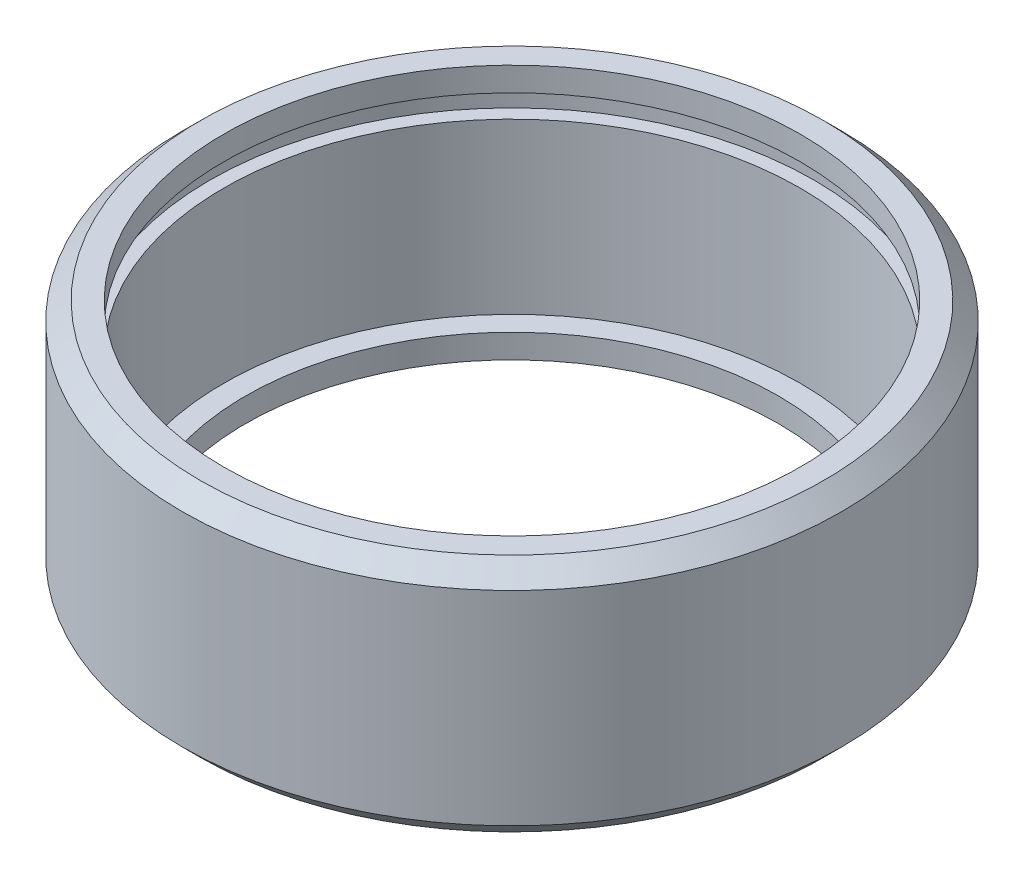
ISO-10303-21;
HEADER;
FILE_DESCRIPTION(('STEP AP214'),'2;1');
FILE_NAME('part.step','',(''),(''),'','','');
FILE_SCHEMA(('AUTOMOTIVE_DESIGN { 1 0 10303 214 1 1 1 1 }'));
ENDSEC;
DATA;
#1=APPLICATION_CONTEXT('core data for automotive mechanical design processes');
#2=APPLICATION_PROTOCOL_DEFINITION('international standard','automotive_design',2000,#1);
#3=PRODUCT_CONTEXT('',#1,'mechanical');
#4=PRODUCT('Part','Part','',(#3));
#5=PRODUCT_RELATED_PRODUCT_CATEGORY('part','',(#4));
#6=PRODUCT_DEFINITION_FORMATION('','',#4);
#7=PRODUCT_DEFINITION_CONTEXT('part definition',#1,'design');
#8=PRODUCT_DEFINITION('design','',#6,#7);
#9=PRODUCT_DEFINITION_SHAPE('','',#8);
#10=(LENGTH_UNIT() NAMED_UNIT(*) SI_UNIT(.MILLI.,.METRE.));
#11=(NAMED_UNIT(*) PLANE_ANGLE_UNIT() SI_UNIT($,.RADIAN.));
#12=(NAMED_UNIT(*) SI_UNIT($,.STERADIAN.) SOLID_ANGLE_UNIT());
#13=UNCERTAINTY_MEASURE_WITH_UNIT(LENGTH_MEASURE(1.E-05),#10,'distance_accuracy_value','');
#14=(GEOMETRIC_REPRESENTATION_CONTEXT(3) GLOBAL_UNCERTAINTY_ASSIGNED_CONTEXT((#13)) GLOBAL_UNIT_ASSIGNED_CONTEXT((#10,
#11,#12)) REPRESENTATION_CONTEXT('',''));
#15=CARTESIAN_POINT('',(0.,0.,0.));
#16=DIRECTION('',(0.,0.,1.));
#17=DIRECTION('',(1.,0.,0.));
#18=AXIS2_PLACEMENT_3D('',#15,#16,#17);
#19=CARTESIAN_POINT('',(13.,0.,0.));
#20=DIRECTION('',(0.,-1.,0.));
#21=DIRECTION('',(0.,0.,-1.));
#22=AXIS2_PLACEMENT_3D('',#19,#20,#21);
#23=PLANE('',#22);
#24=CARTESIAN_POINT('',(0.,0.,0.));
#25=DIRECTION('',(0.,-1.,0.));
#26=DIRECTION('',(0.,0.,-1.));
#27=AXIS2_PLACEMENT_3D('',#24,#25,#26);
#28=CIRCLE('',#27,13.);
#29=CARTESIAN_POINT('',(0.,0.,-13.));
#30=VERTEX_POINT('',#29);
#31=EDGE_CURVE('E94',#30,#30,#28,.T.);
#32=ORIENTED_EDGE('',*,*,#31,.T.);
#33=EDGE_LOOP('',(#32));
#34=FACE_BOUND('',#33,.T.);
#35=CARTESIAN_POINT('',(0.,0.,0.));
#36=DIRECTION('',(0.,-1.,0.));
#37=DIRECTION('',(0.,0.,-1.));
#38=AXIS2_PLACEMENT_3D('',#35,#36,#37);
#39=CIRCLE('',#38,11.1125);
#40=CARTESIAN_POINT('',(0.,0.,-11.1125));
#41=VERTEX_POINT('',#40);
#42=EDGE_CURVE('E10',#41,#41,#39,.T.);
#43=ORIENTED_EDGE('',*,*,#42,.F.);
#44=EDGE_LOOP('',(#43));
#45=FACE_BOUND('',#44,.T.);
#46=ADVANCED_FACE('F43',(#34,#45),#23,.T.);
#47=CARTESIAN_POINT('',(0.,0.,0.));
#48=DIRECTION('',(0.,-1.,0.));
#49=DIRECTION('',(0.,0.,-1.));
#50=AXIS2_PLACEMENT_3D('',#47,#48,#49);
#51=CYLINDRICAL_SURFACE('',#50,11.1125);
#52=ORIENTED_EDGE('',*,*,#42,.T.);
#53=EDGE_LOOP('',(#52));
#54=FACE_BOUND('',#53,.T.);
#55=CARTESIAN_POINT('',(0.,1.,0.));
#56=DIRECTION('',(0.,-1.,0.));
#57=DIRECTION('',(0.,0.,-1.));
#58=AXIS2_PLACEMENT_3D('',#55,#56,#57);
#59=CIRCLE('',#58,11.1125);
#60=CARTESIAN_POINT('',(0.,1.,-11.1125));
#61=VERTEX_POINT('',#60);
#62=EDGE_CURVE('E50',#61,#61,#59,.T.);
#63=ORIENTED_EDGE('',*,*,#62,.F.);
#64=EDGE_LOOP('',(#63));
#65=FACE_BOUND('',#64,.T.);
#66=ADVANCED_FACE('F113',(#54,#65),#51,.F.);
#67=CARTESIAN_POINT('',(11.1125,1.,0.));
#68=DIRECTION('',(0.,1.,0.));
#69=DIRECTION('',(0.,0.,1.));
#70=AXIS2_PLACEMENT_3D('',#67,#68,#69);
#71=PLANE('',#70);
#72=ORIENTED_EDGE('',*,*,#62,.T.);
#73=EDGE_LOOP('',(#72));
#74=FACE_BOUND('',#73,.T.);
#75=CARTESIAN_POINT('',(0.,1.,0.));
#76=DIRECTION('',(0.,-1.,0.));
#77=DIRECTION('',(0.,0.,-1.));
#78=AXIS2_PLACEMENT_3D('',#75,#76,#77);
#79=CIRCLE('',#78,12.025);
#80=CARTESIAN_POINT('',(0.,1.,-12.025));
#81=VERTEX_POINT('',#80);
#82=EDGE_CURVE('E55',#81,#81,#79,.T.);
#83=ORIENTED_EDGE('',*,*,#82,.F.);
#84=EDGE_LOOP('',(#83));
#85=FACE_BOUND('',#84,.T.);
#86=ADVANCED_FACE('F117',(#74,#85),#71,.T.);
#87=CARTESIAN_POINT('',(0.,0.,0.));
#88=DIRECTION('',(0.,-1.,0.));
#89=DIRECTION('',(0.,0.,-1.));
#90=AXIS2_PLACEMENT_3D('',#87,#88,#89);
#91=CYLINDRICAL_SURFACE('',#90,12.025);
#92=ORIENTED_EDGE('',*,*,#82,.T.);
#93=EDGE_LOOP('',(#92));
#94=FACE_BOUND('',#93,.T.);
#95=CARTESIAN_POINT('',(0.,8.05,0.));
#96=DIRECTION('',(0.,-1.,0.));
#97=DIRECTION('',(0.,0.,-1.));
#98=AXIS2_PLACEMENT_3D('',#95,#96,#97);
#99=CIRCLE('',#98,12.025);
#100=CARTESIAN_POINT('',(0.,8.05,-12.025));
#101=VERTEX_POINT('',#100);
#102=EDGE_CURVE('E60',#101,#101,#99,.T.);
#103=ORIENTED_EDGE('',*,*,#102,.F.);
#104=EDGE_LOOP('',(#103));
#105=FACE_BOUND('',#104,.T.);
#106=ADVANCED_FACE('F121',(#94,#105),#91,.F.);
#107=CARTESIAN_POINT('',(12.025,8.05,0.));
#108=DIRECTION('',(0.,1.,0.));
#109=DIRECTION('',(0.,0.,1.));
#110=AXIS2_PLACEMENT_3D('',#107,#108,#109);
#111=PLANE('',#110);
#112=ORIENTED_EDGE('',*,*,#102,.T.);
#113=EDGE_LOOP('',(#112));
#114=FACE_BOUND('',#113,.T.);
#115=CARTESIAN_POINT('',(0.,8.05,0.));
#116=DIRECTION('',(0.,-1.,0.));
#117=DIRECTION('',(0.,0.,-1.));
#118=AXIS2_PLACEMENT_3D('',#115,#116,#117);
#119=CIRCLE('',#118,12.6);
#120=CARTESIAN_POINT('',(0.,8.05,-12.6));
#121=VERTEX_POINT('',#120);
#122=EDGE_CURVE('E66',#121,#121,#119,.T.);
#123=ORIENTED_EDGE('',*,*,#122,.F.);
#124=EDGE_LOOP('',(#123));
#125=FACE_BOUND('',#124,.T.);
#126=ADVANCED_FACE('F127',(#114,#125),#111,.T.);
#127=CARTESIAN_POINT('',(0.,0.,0.));
#128=DIRECTION('',(0.,-1.,0.));
#129=DIRECTION('',(0.,0.,-1.));
#130=AXIS2_PLACEMENT_3D('',#127,#128,#129);
#131=CYLINDRICAL_SURFACE('',#130,12.6);
#132=ORIENTED_EDGE('',*,*,#122,.T.);
#133=EDGE_LOOP('',(#132));
#134=FACE_BOUND('',#133,.T.);
#135=CARTESIAN_POINT('',(0.,9.,0.));
#136=DIRECTION('',(0.,-1.,0.));
#137=DIRECTION('',(0.,0.,-1.));
#138=AXIS2_PLACEMENT_3D('',#135,#136,#137);
#139=CIRCLE('',#138,12.6);
#140=CARTESIAN_POINT('',(0.,9.,-12.6));
#141=VERTEX_POINT('',#140);
#142=EDGE_CURVE('E70',#141,#141,#139,.T.);
#143=ORIENTED_EDGE('',*,*,#142,.F.);
#144=EDGE_LOOP('',(#143));
#145=FACE_BOUND('',#144,.T.);
#146=ADVANCED_FACE('F131',(#134,#145),#131,.F.);
#147=CARTESIAN_POINT('',(12.025,9.,0.));
#148=DIRECTION('',(0.,-1.,0.));
#149=DIRECTION('',(0.,0.,-1.));
#150=AXIS2_PLACEMENT_3D('',#147,#148,#149);
#151=PLANE('',#150);
#152=ORIENTED_EDGE('',*,*,#142,.T.);
#153=EDGE_LOOP('',(#152));
#154=FACE_BOUND('',#153,.T.);
#155=CARTESIAN_POINT('',(0.,9.,0.));
#156=DIRECTION('',(0.,-1.,0.));
#157=DIRECTION('',(0.,0.,-1.));
#158=AXIS2_PLACEMENT_3D('',#155,#156,#157);
#159=CIRCLE('',#158,12.025);
#160=CARTESIAN_POINT('',(0.,9.,-12.025));
#161=VERTEX_POINT('',#160);
#162=EDGE_CURVE('E74',#161,#161,#159,.T.);
#163=ORIENTED_EDGE('',*,*,#162,.F.);
#164=EDGE_LOOP('',(#163));
#165=FACE_BOUND('',#164,.T.);
#166=ADVANCED_FACE('F135',(#154,#165),#151,.T.);
#167=CARTESIAN_POINT('',(0.,0.,0.));
#168=DIRECTION('',(0.,-1.,0.));
#169=DIRECTION('',(0.,0.,-1.));
#170=AXIS2_PLACEMENT_3D('',#167,#168,#169);
#171=CYLINDRICAL_SURFACE('',#170,12.025);
#172=ORIENTED_EDGE('',*,*,#162,.T.);
#173=EDGE_LOOP('',(#172));
#174=FACE_BOUND('',#173,.T.);
#175=CARTESIAN_POINT('',(0.,10.,0.));
#176=DIRECTION('',(0.,-1.,0.));
#177=DIRECTION('',(0.,0.,-1.));
#178=AXIS2_PLACEMENT_3D('',#175,#176,#177);
#179=CIRCLE('',#178,12.025);
#180=CARTESIAN_POINT('',(0.,10.,-12.025));
#181=VERTEX_POINT('',#180);
#182=EDGE_CURVE('E78',#181,#181,#179,.T.);
#183=ORIENTED_EDGE('',*,*,#182,.F.);
#184=EDGE_LOOP('',(#183));
#185=FACE_BOUND('',#184,.T.);
#186=ADVANCED_FACE('F139',(#174,#185),#171,.F.);
#187=CARTESIAN_POINT('',(12.025,10.,0.));
#188=DIRECTION('',(0.,1.,0.));
#189=DIRECTION('',(0.,0.,1.));
#190=AXIS2_PLACEMENT_3D('',#187,#188,#189);
#191=PLANE('',#190);
#192=ORIENTED_EDGE('',*,*,#182,.T.);
#193=EDGE_LOOP('',(#192));
#194=FACE_BOUND('',#193,.T.);
#195=CARTESIAN_POINT('',(0.,10.,0.));
#196=DIRECTION('',(0.,-1.,0.));
#197=DIRECTION('',(0.,0.,-1.));
#198=AXIS2_PLACEMENT_3D('',#195,#196,#197);
#199=CIRCLE('',#198,13.);
#200=CARTESIAN_POINT('',(0.,10.,-13.));
#201=VERTEX_POINT('',#200);
#202=EDGE_CURVE('E82',#201,#201,#199,.T.);
#203=ORIENTED_EDGE('',*,*,#202,.F.);
#204=EDGE_LOOP('',(#203));
#205=FACE_BOUND('',#204,.T.);
#206=ADVANCED_FACE('F143',(#194,#205),#191,.T.);
#207=CARTESIAN_POINT('',(0.,9.25,0.));
#208=DIRECTION('',(0.,-1.,0.));
#209=DIRECTION('',(0.,0.,-1.));
#210=AXIS2_PLACEMENT_3D('',#207,#208,#209);
#211=CONICAL_SURFACE('',#210,13.75,0.785398163397448);
#212=ORIENTED_EDGE('',*,*,#202,.T.);
#213=EDGE_LOOP('',(#212));
#214=FACE_BOUND('',#213,.T.);
#215=CARTESIAN_POINT('',(0.,9.25,0.));
#216=DIRECTION('',(0.,-1.,0.));
#217=DIRECTION('',(0.,0.,-1.));
#218=AXIS2_PLACEMENT_3D('',#215,#216,#217);
#219=CIRCLE('',#218,13.75);
#220=CARTESIAN_POINT('',(0.,9.25,-13.75));
#221=VERTEX_POINT('',#220);
#222=EDGE_CURVE('E86',#221,#221,#219,.T.);
#223=ORIENTED_EDGE('',*,*,#222,.F.);
#224=EDGE_LOOP('',(#223));
#225=FACE_BOUND('',#224,.T.);
#226=ADVANCED_FACE('F109',(#214,#225),#211,.T.);
#227=CARTESIAN_POINT('',(0.,0.,0.));
#228=DIRECTION('',(0.,-1.,0.));
#229=DIRECTION('',(0.,0.,-1.));
#230=AXIS2_PLACEMENT_3D('',#227,#228,#229);
#231=CYLINDRICAL_SURFACE('',#230,13.75);
#232=ORIENTED_EDGE('',*,*,#222,.T.);
#233=EDGE_LOOP('',(#232));
#234=FACE_BOUND('',#233,.T.);
#235=CARTESIAN_POINT('',(0.,0.75,0.));
#236=DIRECTION('',(0.,-1.,0.));
#237=DIRECTION('',(0.,0.,-1.));
#238=AXIS2_PLACEMENT_3D('',#235,#236,#237);
#239=CIRCLE('',#238,13.75);
#240=CARTESIAN_POINT('',(0.,0.75,-13.75));
#241=VERTEX_POINT('',#240);
#242=EDGE_CURVE('E90',#241,#241,#239,.T.);
#243=ORIENTED_EDGE('',*,*,#242,.F.);
#244=EDGE_LOOP('',(#243));
#245=FACE_BOUND('',#244,.T.);
#246=ADVANCED_FACE('F103',(#234,#245),#231,.T.);
#247=CARTESIAN_POINT('',(0.,0.,0.));
#248=DIRECTION('',(0.,1.,0.));
#249=DIRECTION('',(0.,0.,1.));
#250=AXIS2_PLACEMENT_3D('',#247,#248,#249);
#251=CONICAL_SURFACE('',#250,13.,0.785398163397449);
#252=ORIENTED_EDGE('',*,*,#242,.T.);
#253=EDGE_LOOP('',(#252));
#254=FACE_BOUND('',#253,.T.);
#255=ORIENTED_EDGE('',*,*,#31,.F.);
#256=EDGE_LOOP('',(#255));
#257=FACE_BOUND('',#256,.T.);
#258=ADVANCED_FACE('F101',(#254,#257),#251,.T.);
#259=CLOSED_SHELL('',(#46,#66,#86,#106,#126,#146,#166,#186,#206,#226,#246,#258));
#260=MANIFOLD_SOLID_BREP('B2',#259);
#261=ADVANCED_BREP_SHAPE_REPRESENTATION('',(#18,#260),#14);
#262=SHAPE_DEFINITION_REPRESENTATION(#9,#261);
ENDSEC;
END-ISO-10303-21;
